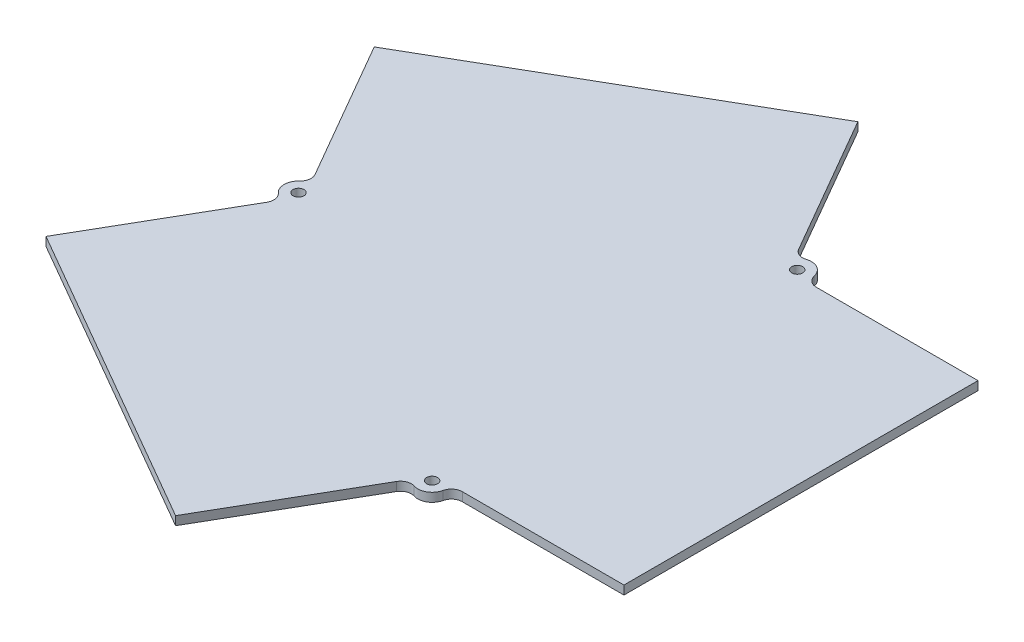
ISO-10303-21;
HEADER;
FILE_DESCRIPTION(('STEP AP214'),'2;1');
FILE_NAME('part.step','',(''),(''),'','','');
FILE_SCHEMA(('AUTOMOTIVE_DESIGN { 1 0 10303 214 1 1 1 1 }'));
ENDSEC;
DATA;
#1=APPLICATION_CONTEXT('core data for automotive mechanical design processes');
#2=APPLICATION_PROTOCOL_DEFINITION('international standard','automotive_design',2000,#1);
#3=PRODUCT_CONTEXT('',#1,'mechanical');
#4=PRODUCT('Part','Part','',(#3));
#5=PRODUCT_RELATED_PRODUCT_CATEGORY('part','',(#4));
#6=PRODUCT_DEFINITION_FORMATION('','',#4);
#7=PRODUCT_DEFINITION_CONTEXT('part definition',#1,'design');
#8=PRODUCT_DEFINITION('design','',#6,#7);
#9=PRODUCT_DEFINITION_SHAPE('','',#8);
#10=(LENGTH_UNIT() NAMED_UNIT(*) SI_UNIT(.MILLI.,.METRE.));
#11=(NAMED_UNIT(*) PLANE_ANGLE_UNIT() SI_UNIT($,.RADIAN.));
#12=(NAMED_UNIT(*) SI_UNIT($,.STERADIAN.) SOLID_ANGLE_UNIT());
#13=UNCERTAINTY_MEASURE_WITH_UNIT(LENGTH_MEASURE(1.E-05),#10,'distance_accuracy_value','');
#14=(GEOMETRIC_REPRESENTATION_CONTEXT(3) GLOBAL_UNCERTAINTY_ASSIGNED_CONTEXT((#13)) GLOBAL_UNIT_ASSIGNED_CONTEXT((#10,
#11,#12)) REPRESENTATION_CONTEXT('',''));
#15=CARTESIAN_POINT('',(0.,0.,0.));
#16=DIRECTION('',(0.,0.,1.));
#17=DIRECTION('',(1.,0.,0.));
#18=AXIS2_PLACEMENT_3D('',#15,#16,#17);
#19=CARTESIAN_POINT('',(-48.8921352138346,2.,28.227887426963));
#20=DIRECTION('',(-0.866025403784438,0.,0.500000000000001));
#21=DIRECTION('',(0.500000000000001,0.,0.866025403784438));
#22=AXIS2_PLACEMENT_3D('',#19,#20,#21);
#23=PLANE('',#22);
#24=DIRECTION('',(-0.500000000000001,0.,-0.866025403784438));
#25=VECTOR('',#24,1.);
#26=CARTESIAN_POINT('',(-48.8921352138346,0.,28.227887426963));
#27=LINE('',#26,#25);
#28=CARTESIAN_POINT('',(-85.4700101744345,0.,-35.1268504376975));
#29=VERTEX_POINT('',#28);
#30=CARTESIAN_POINT('',(-103.965757812806,0.,-67.1624250713291));
#31=VERTEX_POINT('',#30);
#32=EDGE_CURVE('E247',#29,#31,#27,.T.);
#33=ORIENTED_EDGE('',*,*,#32,.F.);
#34=DIRECTION('',(0.,-1.,0.));
#35=VECTOR('',#34,1.);
#36=CARTESIAN_POINT('',(-85.4700101744345,2.,-35.1268504376974));
#37=LINE('',#36,#35);
#38=CARTESIAN_POINT('',(-85.4700101744345,2.,-35.1268504376975));
#39=VERTEX_POINT('',#38);
#40=EDGE_CURVE('E62',#29,#39,#37,.F.);
#41=ORIENTED_EDGE('',*,*,#40,.T.);
#42=DIRECTION('',(-0.500000000000001,0.,-0.866025403784438));
#43=VECTOR('',#42,1.);
#44=CARTESIAN_POINT('',(-48.8921352138346,2.,28.227887426963));
#45=LINE('',#44,#43);
#46=CARTESIAN_POINT('',(-103.965757812806,2.,-67.1624250713291));
#47=VERTEX_POINT('',#46);
#48=EDGE_CURVE('E464',#39,#47,#45,.T.);
#49=ORIENTED_EDGE('',*,*,#48,.T.);
#50=DIRECTION('',(0.,-1.,0.));
#51=VECTOR('',#50,1.);
#52=CARTESIAN_POINT('',(-103.965757812806,2.,-67.1624250713291));
#53=LINE('',#52,#51);
#54=EDGE_CURVE('E234',#47,#31,#53,.T.);
#55=ORIENTED_EDGE('',*,*,#54,.T.);
#56=EDGE_LOOP('',(#33,#41,#49,#55));
#57=FACE_BOUND('',#56,.T.);
#58=ADVANCED_FACE('F46',(#57),#23,.T.);
#59=CARTESIAN_POINT('',(-83.7503568198725,2.,-29.6150024593988));
#60=DIRECTION('',(0.,-1.,0.));
#61=DIRECTION('',(0.,0.,-1.));
#62=AXIS2_PLACEMENT_3D('',#59,#60,#61);
#63=CYLINDRICAL_SURFACE('',#62,3.26666049839541);
#64=CARTESIAN_POINT('',(-83.7503568198725,0.,-29.6150024593988));
#65=DIRECTION('',(0.,1.,0.));
#66=DIRECTION('',(0.,0.,1.));
#67=AXIS2_PLACEMENT_3D('',#64,#65,#66);
#68=CIRCLE('',#67,3.26666049839541);
#69=CARTESIAN_POINT('',(-85.9509460743788,0.,-32.0292265054907));
#70=VERTEX_POINT('',#69);
#71=CARTESIAN_POINT('',(-85.9509460743788,0.,-27.2007784133069));
#72=VERTEX_POINT('',#71);
#73=EDGE_CURVE('E250',#70,#72,#68,.T.);
#74=ORIENTED_EDGE('',*,*,#73,.T.);
#75=DIRECTION('',(0.,-1.,0.));
#76=VECTOR('',#75,1.);
#77=CARTESIAN_POINT('',(-85.9509460743788,2.,-27.2007784133069));
#78=LINE('',#77,#76);
#79=CARTESIAN_POINT('',(-85.9509460743788,2.,-27.2007784133069));
#80=VERTEX_POINT('',#79);
#81=EDGE_CURVE('E339',#72,#80,#78,.F.);
#82=ORIENTED_EDGE('',*,*,#81,.T.);
#83=CARTESIAN_POINT('',(-83.7503568198725,2.,-29.6150024593988));
#84=DIRECTION('',(0.,1.,0.));
#85=DIRECTION('',(0.,0.,1.));
#86=AXIS2_PLACEMENT_3D('',#83,#84,#85);
#87=CIRCLE('',#86,3.26666049839541);
#88=CARTESIAN_POINT('',(-85.9509460743788,2.,-32.0292265054907));
#89=VERTEX_POINT('',#88);
#90=EDGE_CURVE('E195',#89,#80,#87,.T.);
#91=ORIENTED_EDGE('',*,*,#90,.F.);
#92=DIRECTION('',(0.,-1.,0.));
#93=VECTOR('',#92,1.);
#94=CARTESIAN_POINT('',(-85.9509460743788,2.,-32.0292265054907));
#95=LINE('',#94,#93);
#96=EDGE_CURVE('E335',#89,#70,#95,.T.);
#97=ORIENTED_EDGE('',*,*,#96,.T.);
#98=EDGE_LOOP('',(#74,#82,#91,#97));
#99=FACE_BOUND('',#98,.T.);
#100=ADVANCED_FACE('F377',(#99),#63,.T.);
#101=CARTESIAN_POINT('',(-74.5394796768128,2.,-43.0353886566623));
#102=DIRECTION('',(-0.86602540378444,0.,-0.499999999999998));
#103=DIRECTION('',(-0.499999999999998,0.,0.86602540378444));
#104=AXIS2_PLACEMENT_3D('',#101,#102,#103);
#105=PLANE('',#104);
#106=DIRECTION('',(0.499999999999998,0.,-0.86602540378444));
#107=VECTOR('',#106,1.);
#108=CARTESIAN_POINT('',(-74.5394796768128,2.,-43.0353886566623));
#109=LINE('',#108,#107);
#110=CARTESIAN_POINT('',(-103.965757812805,2.,7.93242015252989));
#111=VERTEX_POINT('',#110);
#112=CARTESIAN_POINT('',(-85.4700101744346,2.,-24.1031544811002));
#113=VERTEX_POINT('',#112);
#114=EDGE_CURVE('E174',#111,#113,#109,.T.);
#115=ORIENTED_EDGE('',*,*,#114,.T.);
#116=DIRECTION('',(0.,-1.,0.));
#117=VECTOR('',#116,1.);
#118=CARTESIAN_POINT('',(-85.4700101744346,2.,-24.1031544811002));
#119=LINE('',#118,#117);
#120=CARTESIAN_POINT('',(-85.4700101744346,0.,-24.1031544811002));
#121=VERTEX_POINT('',#120);
#122=EDGE_CURVE('E332',#113,#121,#119,.T.);
#123=ORIENTED_EDGE('',*,*,#122,.T.);
#124=DIRECTION('',(0.499999999999998,0.,-0.86602540378444));
#125=VECTOR('',#124,1.);
#126=CARTESIAN_POINT('',(-74.5394796768128,0.,-43.0353886566623));
#127=LINE('',#126,#125);
#128=CARTESIAN_POINT('',(-103.965757812805,0.,7.93242015252989));
#129=VERTEX_POINT('',#128);
#130=EDGE_CURVE('E177',#129,#121,#127,.T.);
#131=ORIENTED_EDGE('',*,*,#130,.F.);
#132=DIRECTION('',(0.,-1.,0.));
#133=VECTOR('',#132,1.);
#134=CARTESIAN_POINT('',(-103.965757812805,2.,7.93242015252989));
#135=LINE('',#134,#133);
#136=EDGE_CURVE('E170',#111,#129,#135,.T.);
#137=ORIENTED_EDGE('',*,*,#136,.F.);
#138=EDGE_LOOP('',(#115,#123,#131,#137));
#139=FACE_BOUND('',#138,.T.);
#140=ADVANCED_FACE('F172',(#139),#105,.T.);
#141=CARTESIAN_POINT('',(-29.4262781359925,2.,50.9678088091923));
#142=DIRECTION('',(-0.5,0.,0.866025403784439));
#143=DIRECTION('',(0.866025403784439,0.,0.5));
#144=AXIS2_PLACEMENT_3D('',#141,#142,#143);
#145=PLANE('',#144);
#146=DIRECTION('',(-0.866025403784439,0.,-0.5));
#147=VECTOR('',#146,1.);
#148=CARTESIAN_POINT('',(-29.4262781359925,0.,50.9678088091923));
#149=LINE('',#148,#147);
#150=CARTESIAN_POINT('',(-33.8177001062657,0.,48.4324201525298));
#151=VERTEX_POINT('',#150);
#152=EDGE_CURVE('E256',#151,#129,#149,.T.);
#153=ORIENTED_EDGE('',*,*,#152,.F.);
#154=DIRECTION('',(0.,-1.,0.));
#155=VECTOR('',#154,1.);
#156=CARTESIAN_POINT('',(-33.8177001062657,2.,48.4324201525298));
#157=LINE('',#156,#155);
#158=CARTESIAN_POINT('',(-33.8177001062657,2.,48.4324201525298));
#159=VERTEX_POINT('',#158);
#160=EDGE_CURVE('E184',#159,#151,#157,.T.);
#161=ORIENTED_EDGE('',*,*,#160,.F.);
#162=DIRECTION('',(-0.866025403784439,0.,-0.5));
#163=VECTOR('',#162,1.);
#164=CARTESIAN_POINT('',(-29.4262781359925,2.,50.9678088091923));
#165=LINE('',#164,#163);
#166=EDGE_CURVE('E190',#159,#111,#165,.T.);
#167=ORIENTED_EDGE('',*,*,#166,.T.);
#168=ORIENTED_EDGE('',*,*,#136,.T.);
#169=EDGE_LOOP('',(#153,#161,#167,#168));
#170=FACE_BOUND('',#169,.T.);
#171=ADVANCED_FACE('F198',(#170),#145,.T.);
#172=CARTESIAN_POINT('',(-4.39142197027308,2.,-2.53538865666241));
#173=DIRECTION('',(0.866025403784438,0.,0.500000000000001));
#174=DIRECTION('',(0.500000000000001,0.,-0.866025403784438));
#175=AXIS2_PLACEMENT_3D('',#172,#173,#174);
#176=PLANE('',#175);
#177=DIRECTION('',(-0.500000000000001,0.,0.866025403784438));
#178=VECTOR('',#177,1.);
#179=CARTESIAN_POINT('',(-4.39142197027308,0.,-2.53538865666241));
#180=LINE('',#179,#178);
#181=CARTESIAN_POINT('',(-15.321952467894,0.,16.3968455188981));
#182=VERTEX_POINT('',#181);
#183=EDGE_CURVE('E259',#182,#151,#180,.T.);
#184=ORIENTED_EDGE('',*,*,#183,.F.);
#185=DIRECTION('',(0.,-1.,0.));
#186=VECTOR('',#185,1.);
#187=CARTESIAN_POINT('',(-15.321952467894,2.,16.3968455188982));
#188=LINE('',#187,#186);
#189=CARTESIAN_POINT('',(-15.321952467894,2.,16.3968455188981));
#190=VERTEX_POINT('',#189);
#191=EDGE_CURVE('E325',#182,#190,#188,.F.);
#192=ORIENTED_EDGE('',*,*,#191,.T.);
#193=DIRECTION('',(-0.500000000000001,0.,0.866025403784438));
#194=VECTOR('',#193,1.);
#195=CARTESIAN_POINT('',(-4.39142197027308,2.,-2.53538865666241));
#196=LINE('',#195,#194);
#197=EDGE_CURVE('E201',#190,#159,#196,.T.);
#198=ORIENTED_EDGE('',*,*,#197,.T.);
#199=ORIENTED_EDGE('',*,*,#160,.T.);
#200=EDGE_LOOP('',(#184,#192,#198,#199));
#201=FACE_BOUND('',#200,.T.);
#202=ADVANCED_FACE('F514',(#201),#176,.T.);
#203=CARTESIAN_POINT('',(-11.4083787741721,2.,12.1516580389955));
#204=DIRECTION('',(0.,-1.,0.));
#205=DIRECTION('',(0.,0.,-1.));
#206=AXIS2_PLACEMENT_3D('',#203,#204,#205);
#207=CYLINDRICAL_SURFACE('',#206,3.26666049839439);
#208=CARTESIAN_POINT('',(-11.4083787741721,2.,12.1516580389955));
#209=DIRECTION('',(0.,1.,0.));
#210=DIRECTION('',(0.,0.,1.));
#211=AXIS2_PLACEMENT_3D('',#208,#209,#210);
#212=CIRCLE('',#211,3.26666049839439);
#213=CARTESIAN_POINT('',(-12.3988635012608,2.,15.2645362597383));
#214=VERTEX_POINT('',#213);
#215=CARTESIAN_POINT('',(-8.21730479257729,2.,12.8503122136476));
#216=VERTEX_POINT('',#215);
#217=EDGE_CURVE('E204',#214,#216,#212,.T.);
#218=ORIENTED_EDGE('',*,*,#217,.F.);
#219=DIRECTION('',(0.,-1.,0.));
#220=VECTOR('',#219,1.);
#221=CARTESIAN_POINT('',(-12.3988635012608,2.,15.2645362597383));
#222=LINE('',#221,#220);
#223=CARTESIAN_POINT('',(-12.3988635012608,0.,15.2645362597383));
#224=VERTEX_POINT('',#223);
#225=EDGE_CURVE('E321',#214,#224,#222,.T.);
#226=ORIENTED_EDGE('',*,*,#225,.T.);
#227=CARTESIAN_POINT('',(-11.4083787741721,0.,12.1516580389955));
#228=DIRECTION('',(0.,1.,0.));
#229=DIRECTION('',(0.,0.,1.));
#230=AXIS2_PLACEMENT_3D('',#227,#228,#229);
#231=CIRCLE('',#230,3.26666049839439);
#232=CARTESIAN_POINT('',(-8.21730479257729,0.,12.8503122136476));
#233=VERTEX_POINT('',#232);
#234=EDGE_CURVE('E262',#224,#233,#231,.T.);
#235=ORIENTED_EDGE('',*,*,#234,.T.);
#236=DIRECTION('',(0.,-1.,0.));
#237=VECTOR('',#236,1.);
#238=CARTESIAN_POINT('',(-8.21730479257729,2.,12.8503122136476));
#239=LINE('',#238,#237);
#240=EDGE_CURVE('E318',#233,#216,#239,.F.);
#241=ORIENTED_EDGE('',*,*,#240,.T.);
#242=EDGE_LOOP('',(#218,#226,#235,#241));
#243=FACE_BOUND('',#242,.T.);
#244=ADVANCED_FACE('F431',(#243),#207,.T.);
#245=CARTESIAN_POINT('',(0.,2.,10.8849975406012));
#246=DIRECTION('',(0.,0.,1.));
#247=DIRECTION('',(1.,0.,0.));
#248=AXIS2_PLACEMENT_3D('',#245,#246,#247);
#249=PLANE('',#248);
#250=DIRECTION('',(-1.,0.,0.));
#251=VECTOR('',#250,1.);
#252=CARTESIAN_POINT('',(0.,2.,10.8849975406012));
#253=LINE('',#252,#251);
#254=CARTESIAN_POINT('',(31.2163435508577,2.,10.8849975406012));
#255=VERTEX_POINT('',#254);
#256=CARTESIAN_POINT('',(-5.77515172588787,2.,10.8849975406012));
#257=VERTEX_POINT('',#256);
#258=EDGE_CURVE('E211',#255,#257,#253,.T.);
#259=ORIENTED_EDGE('',*,*,#258,.T.);
#260=DIRECTION('',(0.,-1.,0.));
#261=VECTOR('',#260,1.);
#262=CARTESIAN_POINT('',(-5.77515172588787,2.,10.8849975406012));
#263=LINE('',#262,#261);
#264=CARTESIAN_POINT('',(-5.77515172588787,0.,10.8849975406012));
#265=VERTEX_POINT('',#264);
#266=EDGE_CURVE('E328',#257,#265,#263,.T.);
#267=ORIENTED_EDGE('',*,*,#266,.T.);
#268=DIRECTION('',(-1.,0.,0.));
#269=VECTOR('',#268,1.);
#270=CARTESIAN_POINT('',(0.,0.,10.8849975406012));
#271=LINE('',#270,#269);
#272=CARTESIAN_POINT('',(31.2163435508577,0.,10.8849975406012));
#273=VERTEX_POINT('',#272);
#274=EDGE_CURVE('E266',#273,#265,#271,.T.);
#275=ORIENTED_EDGE('',*,*,#274,.F.);
#276=DIRECTION('',(0.,-1.,0.));
#277=VECTOR('',#276,1.);
#278=CARTESIAN_POINT('',(31.2163435508577,2.,10.8849975406012));
#279=LINE('',#278,#277);
#280=EDGE_CURVE('E300',#255,#273,#279,.T.);
#281=ORIENTED_EDGE('',*,*,#280,.F.);
#282=EDGE_LOOP('',(#259,#267,#275,#281));
#283=FACE_BOUND('',#282,.T.);
#284=ADVANCED_FACE('F438',(#283),#249,.T.);
#285=CARTESIAN_POINT('',(31.2163435508577,2.,0.));
#286=DIRECTION('',(1.,0.,0.));
#287=DIRECTION('',(0.,0.,-1.));
#288=AXIS2_PLACEMENT_3D('',#285,#286,#287);
#289=PLANE('',#288);
#290=DIRECTION('',(0.,0.,1.));
#291=VECTOR('',#290,1.);
#292=CARTESIAN_POINT('',(31.2163435508577,0.,0.));
#293=LINE('',#292,#291);
#294=CARTESIAN_POINT('',(31.2163435508577,0.,-70.1150024594117));
#295=VERTEX_POINT('',#294);
#296=EDGE_CURVE('E270',#295,#273,#293,.T.);
#297=ORIENTED_EDGE('',*,*,#296,.F.);
#298=DIRECTION('',(0.,-1.,0.));
#299=VECTOR('',#298,1.);
#300=CARTESIAN_POINT('',(31.2163435508577,2.,-70.1150024594117));
#301=LINE('',#300,#299);
#302=CARTESIAN_POINT('',(31.2163435508577,2.,-70.1150024594117));
#303=VERTEX_POINT('',#302);
#304=EDGE_CURVE('E296',#303,#295,#301,.T.);
#305=ORIENTED_EDGE('',*,*,#304,.F.);
#306=DIRECTION('',(0.,0.,1.));
#307=VECTOR('',#306,1.);
#308=CARTESIAN_POINT('',(31.2163435508577,2.,0.));
#309=LINE('',#308,#307);
#310=EDGE_CURVE('E215',#303,#255,#309,.T.);
#311=ORIENTED_EDGE('',*,*,#310,.T.);
#312=ORIENTED_EDGE('',*,*,#280,.T.);
#313=EDGE_LOOP('',(#297,#305,#311,#312));
#314=FACE_BOUND('',#313,.T.);
#315=ADVANCED_FACE('F442',(#314),#289,.T.);
#316=CARTESIAN_POINT('',(0.,2.,-70.1150024594117));
#317=DIRECTION('',(0.,0.,-1.));
#318=DIRECTION('',(-1.,0.,0.));
#319=AXIS2_PLACEMENT_3D('',#316,#317,#318);
#320=PLANE('',#319);
#321=DIRECTION('',(1.,0.,0.));
#322=VECTOR('',#321,1.);
#323=CARTESIAN_POINT('',(0.,0.,-70.1150024594117));
#324=LINE('',#323,#322);
#325=CARTESIAN_POINT('',(-5.77515172586313,0.,-70.1150024594117));
#326=VERTEX_POINT('',#325);
#327=EDGE_CURVE('E274',#326,#295,#324,.T.);
#328=ORIENTED_EDGE('',*,*,#327,.F.);
#329=DIRECTION('',(0.,-1.,0.));
#330=VECTOR('',#329,1.);
#331=CARTESIAN_POINT('',(-5.77515172586313,2.,-70.1150024594117));
#332=LINE('',#331,#330);
#333=CARTESIAN_POINT('',(-5.77515172586313,2.,-70.1150024594117));
#334=VERTEX_POINT('',#333);
#335=EDGE_CURVE('E315',#326,#334,#332,.F.);
#336=ORIENTED_EDGE('',*,*,#335,.T.);
#337=DIRECTION('',(1.,0.,0.));
#338=VECTOR('',#337,1.);
#339=CARTESIAN_POINT('',(0.,2.,-70.1150024594117));
#340=LINE('',#339,#338);
#341=EDGE_CURVE('E219',#334,#303,#340,.T.);
#342=ORIENTED_EDGE('',*,*,#341,.T.);
#343=ORIENTED_EDGE('',*,*,#304,.T.);
#344=EDGE_LOOP('',(#328,#336,#342,#343));
#345=FACE_BOUND('',#344,.T.);
#346=ADVANCED_FACE('F505',(#345),#320,.T.);
#347=CARTESIAN_POINT('',(-11.4083787741483,2.,-71.3816629578069));
#348=DIRECTION('',(0.,-1.,0.));
#349=DIRECTION('',(0.,0.,-1.));
#350=AXIS2_PLACEMENT_3D('',#347,#348,#349);
#351=CYLINDRICAL_SURFACE('',#350,3.26666049839515);
#352=CARTESIAN_POINT('',(-11.4083787741483,0.,-71.3816629578069));
#353=DIRECTION('',(0.,1.,0.));
#354=DIRECTION('',(0.,0.,1.));
#355=AXIS2_PLACEMENT_3D('',#352,#353,#354);
#356=CIRCLE('',#355,3.26666049839515);
#357=CARTESIAN_POINT('',(-8.21730479255264,0.,-72.0803171324586));
#358=VERTEX_POINT('',#357);
#359=CARTESIAN_POINT('',(-12.3988635012377,0.,-74.4945411785501));
#360=VERTEX_POINT('',#359);
#361=EDGE_CURVE('E277',#358,#360,#356,.T.);
#362=ORIENTED_EDGE('',*,*,#361,.T.);
#363=DIRECTION('',(0.,-1.,0.));
#364=VECTOR('',#363,1.);
#365=CARTESIAN_POINT('',(-12.3988635012377,2.,-74.4945411785501));
#366=LINE('',#365,#364);
#367=CARTESIAN_POINT('',(-12.3988635012377,2.,-74.4945411785501));
#368=VERTEX_POINT('',#367);
#369=EDGE_CURVE('E312',#360,#368,#366,.F.);
#370=ORIENTED_EDGE('',*,*,#369,.T.);
#371=CARTESIAN_POINT('',(-11.4083787741483,2.,-71.3816629578069));
#372=DIRECTION('',(0.,1.,0.));
#373=DIRECTION('',(0.,0.,1.));
#374=AXIS2_PLACEMENT_3D('',#371,#372,#373);
#375=CIRCLE('',#374,3.26666049839515);
#376=CARTESIAN_POINT('',(-8.21730479255264,2.,-72.0803171324586));
#377=VERTEX_POINT('',#376);
#378=EDGE_CURVE('E222',#377,#368,#375,.T.);
#379=ORIENTED_EDGE('',*,*,#378,.F.);
#380=DIRECTION('',(0.,-1.,0.));
#381=VECTOR('',#380,1.);
#382=CARTESIAN_POINT('',(-8.21730479255264,2.,-72.0803171324586));
#383=LINE('',#382,#381);
#384=EDGE_CURVE('E308',#377,#358,#383,.T.);
#385=ORIENTED_EDGE('',*,*,#384,.T.);
#386=EDGE_LOOP('',(#362,#370,#379,#385));
#387=FACE_BOUND('',#386,.T.);
#388=ADVANCED_FACE('F452',(#387),#351,.T.);
#389=CARTESIAN_POINT('',(21.255922492728,2.,-12.2721125730503));
#390=DIRECTION('',(0.866025403784438,0.,-0.5));
#391=DIRECTION('',(-0.5,0.,-0.866025403784439));
#392=AXIS2_PLACEMENT_3D('',#389,#390,#391);
#393=PLANE('',#392);
#394=DIRECTION('',(0.5,0.,0.866025403784439));
#395=VECTOR('',#394,1.);
#396=CARTESIAN_POINT('',(21.255922492728,2.,-12.2721125730503));
#397=LINE('',#396,#395);
#398=CARTESIAN_POINT('',(-33.8177001062435,2.,-107.662425071342));
#399=VERTEX_POINT('',#398);
#400=CARTESIAN_POINT('',(-15.3219524678714,2.,-75.6268504377099));
#401=VERTEX_POINT('',#400);
#402=EDGE_CURVE('E226',#399,#401,#397,.T.);
#403=ORIENTED_EDGE('',*,*,#402,.T.);
#404=DIRECTION('',(0.,-1.,0.));
#405=VECTOR('',#404,1.);
#406=CARTESIAN_POINT('',(-15.3219524678714,2.,-75.6268504377099));
#407=LINE('',#406,#405);
#408=CARTESIAN_POINT('',(-15.3219524678714,0.,-75.6268504377099));
#409=VERTEX_POINT('',#408);
#410=EDGE_CURVE('E183',#401,#409,#407,.T.);
#411=ORIENTED_EDGE('',*,*,#410,.T.);
#412=DIRECTION('',(0.5,0.,0.866025403784439));
#413=VECTOR('',#412,1.);
#414=CARTESIAN_POINT('',(21.255922492728,0.,-12.2721125730503));
#415=LINE('',#414,#413);
#416=CARTESIAN_POINT('',(-33.8177001062435,0.,-107.662425071342));
#417=VERTEX_POINT('',#416);
#418=EDGE_CURVE('E281',#417,#409,#415,.T.);
#419=ORIENTED_EDGE('',*,*,#418,.F.);
#420=DIRECTION('',(0.,-1.,0.));
#421=VECTOR('',#420,1.);
#422=CARTESIAN_POINT('',(-33.8177001062435,2.,-107.662425071342));
#423=LINE('',#422,#421);
#424=EDGE_CURVE('E293',#399,#417,#423,.T.);
#425=ORIENTED_EDGE('',*,*,#424,.F.);
#426=EDGE_LOOP('',(#403,#411,#419,#425));
#427=FACE_BOUND('',#426,.T.);
#428=ADVANCED_FACE('F403',(#427),#393,.T.);
#429=CARTESIAN_POINT('',(-11.4083787741721,2.,12.1516580389955));
#430=DIRECTION('',(0.,-1.,0.));
#431=DIRECTION('',(0.,0.,-1.));
#432=AXIS2_PLACEMENT_3D('',#429,#430,#431);
#433=CYLINDRICAL_SURFACE('',#432,1.25);
#434=CARTESIAN_POINT('',(-11.4083787741721,2.,12.1516580389955));
#435=DIRECTION('',(0.,1.,0.));
#436=DIRECTION('',(0.,0.,1.));
#437=AXIS2_PLACEMENT_3D('',#434,#435,#436);
#438=CIRCLE('',#437,1.25);
#439=CARTESIAN_POINT('',(-11.4083787741721,2.,13.4016580389955));
#440=VERTEX_POINT('',#439);
#441=EDGE_CURVE('E467',#440,#440,#438,.T.);
#442=ORIENTED_EDGE('',*,*,#441,.T.);
#443=EDGE_LOOP('',(#442));
#444=FACE_BOUND('',#443,.T.);
#445=CARTESIAN_POINT('',(-11.4083787741721,0.,12.1516580389955));
#446=DIRECTION('',(0.,1.,0.));
#447=DIRECTION('',(0.,0.,1.));
#448=AXIS2_PLACEMENT_3D('',#445,#446,#447);
#449=CIRCLE('',#448,1.25);
#450=CARTESIAN_POINT('',(-11.4083787741721,0.,13.4016580389955));
#451=VERTEX_POINT('',#450);
#452=EDGE_CURVE('E243',#451,#451,#449,.T.);
#453=ORIENTED_EDGE('',*,*,#452,.F.);
#454=EDGE_LOOP('',(#453));
#455=FACE_BOUND('',#454,.T.);
#456=ADVANCED_FACE('F399',(#444,#455),#433,.F.);
#457=CARTESIAN_POINT('',(-11.4083787741483,2.,-71.3816629578069));
#458=DIRECTION('',(0.,-1.,0.));
#459=DIRECTION('',(0.,0.,-1.));
#460=AXIS2_PLACEMENT_3D('',#457,#458,#459);
#461=CYLINDRICAL_SURFACE('',#460,1.25);
#462=CARTESIAN_POINT('',(-11.4083787741483,2.,-71.3816629578069));
#463=DIRECTION('',(0.,1.,0.));
#464=DIRECTION('',(0.,0.,1.));
#465=AXIS2_PLACEMENT_3D('',#462,#463,#464);
#466=CIRCLE('',#465,1.25);
#467=CARTESIAN_POINT('',(-11.4083787741483,2.,-70.1316629578068));
#468=VERTEX_POINT('',#467);
#469=EDGE_CURVE('E472',#468,#468,#466,.T.);
#470=ORIENTED_EDGE('',*,*,#469,.T.);
#471=EDGE_LOOP('',(#470));
#472=FACE_BOUND('',#471,.T.);
#473=CARTESIAN_POINT('',(-11.4083787741483,0.,-71.3816629578069));
#474=DIRECTION('',(0.,1.,0.));
#475=DIRECTION('',(0.,0.,1.));
#476=AXIS2_PLACEMENT_3D('',#473,#474,#475);
#477=CIRCLE('',#476,1.25);
#478=CARTESIAN_POINT('',(-11.4083787741483,0.,-70.1316629578068));
#479=VERTEX_POINT('',#478);
#480=EDGE_CURVE('E239',#479,#479,#477,.T.);
#481=ORIENTED_EDGE('',*,*,#480,.F.);
#482=EDGE_LOOP('',(#481));
#483=FACE_BOUND('',#482,.T.);
#484=ADVANCED_FACE('F402',(#472,#483),#461,.F.);
#485=CARTESIAN_POINT('',(-83.7503568198725,2.,-29.6150024593988));
#486=DIRECTION('',(0.,-1.,0.));
#487=DIRECTION('',(0.,0.,-1.));
#488=AXIS2_PLACEMENT_3D('',#485,#486,#487);
#489=CYLINDRICAL_SURFACE('',#488,1.25);
#490=CARTESIAN_POINT('',(-83.7503568198725,2.,-29.6150024593988));
#491=DIRECTION('',(0.,1.,0.));
#492=DIRECTION('',(0.,0.,1.));
#493=AXIS2_PLACEMENT_3D('',#490,#491,#492);
#494=CIRCLE('',#493,1.25);
#495=CARTESIAN_POINT('',(-83.7503568198725,2.,-28.3650024593988));
#496=VERTEX_POINT('',#495);
#497=EDGE_CURVE('E289',#496,#496,#494,.T.);
#498=ORIENTED_EDGE('',*,*,#497,.T.);
#499=EDGE_LOOP('',(#498));
#500=FACE_BOUND('',#499,.T.);
#501=CARTESIAN_POINT('',(-83.7503568198725,0.,-29.6150024593988));
#502=DIRECTION('',(0.,1.,0.));
#503=DIRECTION('',(0.,0.,1.));
#504=AXIS2_PLACEMENT_3D('',#501,#502,#503);
#505=CIRCLE('',#504,1.25);
#506=CARTESIAN_POINT('',(-83.7503568198725,0.,-28.3650024593988));
#507=VERTEX_POINT('',#506);
#508=EDGE_CURVE('E235',#507,#507,#505,.T.);
#509=ORIENTED_EDGE('',*,*,#508,.F.);
#510=EDGE_LOOP('',(#509));
#511=FACE_BOUND('',#510,.T.);
#512=ADVANCED_FACE('F407',(#500,#511),#489,.F.);
#513=CARTESIAN_POINT('',(-55.0736225989715,2.,-95.3903124982921));
#514=DIRECTION('',(-0.5,0.,-0.866025403784439));
#515=DIRECTION('',(-0.866025403784439,0.,0.5));
#516=AXIS2_PLACEMENT_3D('',#513,#514,#515);
#517=PLANE('',#516);
#518=DIRECTION('',(0.866025403784439,0.,-0.5));
#519=VECTOR('',#518,1.);
#520=CARTESIAN_POINT('',(-55.0736225989715,0.,-95.3903124982921));
#521=LINE('',#520,#519);
#522=EDGE_CURVE('E285',#31,#417,#521,.T.);
#523=ORIENTED_EDGE('',*,*,#522,.F.);
#524=ORIENTED_EDGE('',*,*,#54,.F.);
#525=DIRECTION('',(0.866025403784439,0.,-0.5));
#526=VECTOR('',#525,1.);
#527=CARTESIAN_POINT('',(-55.0736225989715,2.,-95.3903124982921));
#528=LINE('',#527,#526);
#529=EDGE_CURVE('E230',#47,#399,#528,.T.);
#530=ORIENTED_EDGE('',*,*,#529,.T.);
#531=ORIENTED_EDGE('',*,*,#424,.T.);
#532=EDGE_LOOP('',(#523,#524,#530,#531));
#533=FACE_BOUND('',#532,.T.);
#534=ADVANCED_FACE('F411',(#533),#517,.T.);
#535=CARTESIAN_POINT('',(0.,2.,0.));
#536=DIRECTION('',(0.,1.,0.));
#537=DIRECTION('',(0.,0.,1.));
#538=AXIS2_PLACEMENT_3D('',#535,#536,#537);
#539=PLANE('',#538);
#540=ORIENTED_EDGE('',*,*,#497,.F.);
#541=EDGE_LOOP('',(#540));
#542=FACE_BOUND('',#541,.T.);
#543=ORIENTED_EDGE('',*,*,#469,.F.);
#544=EDGE_LOOP('',(#543));
#545=FACE_BOUND('',#544,.T.);
#546=ORIENTED_EDGE('',*,*,#441,.F.);
#547=EDGE_LOOP('',(#546));
#548=FACE_BOUND('',#547,.T.);
#549=ORIENTED_EDGE('',*,*,#48,.F.);
#550=CARTESIAN_POINT('',(-87.6350736838956,2.,-33.8768504376974));
#551=DIRECTION('',(0.,1.,0.));
#552=DIRECTION('',(0.,0.,1.));
#553=AXIS2_PLACEMENT_3D('',#550,#551,#552);
#554=CIRCLE('',#553,2.5);
#555=EDGE_CURVE('E11',#39,#89,#554,.F.);
#556=ORIENTED_EDGE('',*,*,#555,.T.);
#557=ORIENTED_EDGE('',*,*,#90,.T.);
#558=CARTESIAN_POINT('',(-87.6350736838957,2.,-25.3531544811002));
#559=DIRECTION('',(0.,1.,0.));
#560=DIRECTION('',(0.,0.,1.));
#561=AXIS2_PLACEMENT_3D('',#558,#559,#560);
#562=CIRCLE('',#561,2.5);
#563=EDGE_CURVE('E193',#80,#113,#562,.F.);
#564=ORIENTED_EDGE('',*,*,#563,.T.);
#565=ORIENTED_EDGE('',*,*,#114,.F.);
#566=ORIENTED_EDGE('',*,*,#166,.F.);
#567=ORIENTED_EDGE('',*,*,#197,.F.);
#568=CARTESIAN_POINT('',(-13.1568889584329,2.,17.6468455188982));
#569=DIRECTION('',(0.,1.,0.));
#570=DIRECTION('',(0.,0.,1.));
#571=AXIS2_PLACEMENT_3D('',#568,#569,#570);
#572=CIRCLE('',#571,2.5);
#573=EDGE_CURVE('E359',#190,#214,#572,.F.);
#574=ORIENTED_EDGE('',*,*,#573,.T.);
#575=ORIENTED_EDGE('',*,*,#217,.T.);
#576=CARTESIAN_POINT('',(-5.77515172588786,2.,13.3849975406012));
#577=DIRECTION('',(0.,1.,0.));
#578=DIRECTION('',(0.,0.,1.));
#579=AXIS2_PLACEMENT_3D('',#576,#577,#578);
#580=CIRCLE('',#579,2.5);
#581=EDGE_CURVE('E365',#216,#257,#580,.F.);
#582=ORIENTED_EDGE('',*,*,#581,.T.);
#583=ORIENTED_EDGE('',*,*,#258,.F.);
#584=ORIENTED_EDGE('',*,*,#310,.F.);
#585=ORIENTED_EDGE('',*,*,#341,.F.);
#586=CARTESIAN_POINT('',(-5.77515172586313,2.,-72.6150024594117));
#587=DIRECTION('',(0.,1.,0.));
#588=DIRECTION('',(0.,0.,1.));
#589=AXIS2_PLACEMENT_3D('',#586,#587,#588);
#590=CIRCLE('',#589,2.5);
#591=EDGE_CURVE('E353',#334,#377,#590,.F.);
#592=ORIENTED_EDGE('',*,*,#591,.T.);
#593=ORIENTED_EDGE('',*,*,#378,.T.);
#594=CARTESIAN_POINT('',(-13.1568889584103,2.,-76.8768504377099));
#595=DIRECTION('',(0.,1.,0.));
#596=DIRECTION('',(0.,0.,1.));
#597=AXIS2_PLACEMENT_3D('',#594,#595,#596);
#598=CIRCLE('',#597,2.5);
#599=EDGE_CURVE('E347',#368,#401,#598,.F.);
#600=ORIENTED_EDGE('',*,*,#599,.T.);
#601=ORIENTED_EDGE('',*,*,#402,.F.);
#602=ORIENTED_EDGE('',*,*,#529,.F.);
#603=EDGE_LOOP('',(#549,#556,#557,#564,#565,#566,#567,#574,#575,#582,#583,#584,#585,#592,#593,
#600,#601,#602));
#604=FACE_BOUND('',#603,.T.);
#605=ADVANCED_FACE('F188',(#542,#545,#548,#604),#539,.T.);
#606=CARTESIAN_POINT('',(0.,0.,0.));
#607=DIRECTION('',(0.,1.,0.));
#608=DIRECTION('',(0.,0.,1.));
#609=AXIS2_PLACEMENT_3D('',#606,#607,#608);
#610=PLANE('',#609);
#611=ORIENTED_EDGE('',*,*,#508,.T.);
#612=EDGE_LOOP('',(#611));
#613=FACE_BOUND('',#612,.T.);
#614=ORIENTED_EDGE('',*,*,#480,.T.);
#615=EDGE_LOOP('',(#614));
#616=FACE_BOUND('',#615,.T.);
#617=ORIENTED_EDGE('',*,*,#452,.T.);
#618=EDGE_LOOP('',(#617));
#619=FACE_BOUND('',#618,.T.);
#620=ORIENTED_EDGE('',*,*,#73,.F.);
#621=CARTESIAN_POINT('',(-87.6350736838956,0.,-33.8768504376974));
#622=DIRECTION('',(0.,1.,0.));
#623=DIRECTION('',(0.,0.,1.));
#624=AXIS2_PLACEMENT_3D('',#621,#622,#623);
#625=CIRCLE('',#624,2.5);
#626=EDGE_CURVE('E55',#70,#29,#625,.T.);
#627=ORIENTED_EDGE('',*,*,#626,.T.);
#628=ORIENTED_EDGE('',*,*,#32,.T.);
#629=ORIENTED_EDGE('',*,*,#522,.T.);
#630=ORIENTED_EDGE('',*,*,#418,.T.);
#631=CARTESIAN_POINT('',(-13.1568889584103,0.,-76.8768504377099));
#632=DIRECTION('',(0.,1.,0.));
#633=DIRECTION('',(0.,0.,1.));
#634=AXIS2_PLACEMENT_3D('',#631,#632,#633);
#635=CIRCLE('',#634,2.5);
#636=EDGE_CURVE('E344',#409,#360,#635,.T.);
#637=ORIENTED_EDGE('',*,*,#636,.T.);
#638=ORIENTED_EDGE('',*,*,#361,.F.);
#639=CARTESIAN_POINT('',(-5.77515172586313,0.,-72.6150024594117));
#640=DIRECTION('',(0.,1.,0.));
#641=DIRECTION('',(0.,0.,1.));
#642=AXIS2_PLACEMENT_3D('',#639,#640,#641);
#643=CIRCLE('',#642,2.5);
#644=EDGE_CURVE('E350',#358,#326,#643,.T.);
#645=ORIENTED_EDGE('',*,*,#644,.T.);
#646=ORIENTED_EDGE('',*,*,#327,.T.);
#647=ORIENTED_EDGE('',*,*,#296,.T.);
#648=ORIENTED_EDGE('',*,*,#274,.T.);
#649=CARTESIAN_POINT('',(-5.77515172588786,0.,13.3849975406012));
#650=DIRECTION('',(0.,1.,0.));
#651=DIRECTION('',(0.,0.,1.));
#652=AXIS2_PLACEMENT_3D('',#649,#650,#651);
#653=CIRCLE('',#652,2.5);
#654=EDGE_CURVE('E362',#265,#233,#653,.T.);
#655=ORIENTED_EDGE('',*,*,#654,.T.);
#656=ORIENTED_EDGE('',*,*,#234,.F.);
#657=CARTESIAN_POINT('',(-13.1568889584329,0.,17.6468455188982));
#658=DIRECTION('',(0.,1.,0.));
#659=DIRECTION('',(0.,0.,1.));
#660=AXIS2_PLACEMENT_3D('',#657,#658,#659);
#661=CIRCLE('',#660,2.5);
#662=EDGE_CURVE('E356',#224,#182,#661,.T.);
#663=ORIENTED_EDGE('',*,*,#662,.T.);
#664=ORIENTED_EDGE('',*,*,#183,.T.);
#665=ORIENTED_EDGE('',*,*,#152,.T.);
#666=ORIENTED_EDGE('',*,*,#130,.T.);
#667=CARTESIAN_POINT('',(-87.6350736838957,0.,-25.3531544811002));
#668=DIRECTION('',(0.,1.,0.));
#669=DIRECTION('',(0.,0.,1.));
#670=AXIS2_PLACEMENT_3D('',#667,#668,#669);
#671=CIRCLE('',#670,2.5);
#672=EDGE_CURVE('E368',#121,#72,#671,.T.);
#673=ORIENTED_EDGE('',*,*,#672,.T.);
#674=EDGE_LOOP('',(#620,#627,#628,#629,#630,#637,#638,#645,#646,#647,#648,#655,#656,#663,#664,
#665,#666,#673));
#675=FACE_BOUND('',#674,.T.);
#676=ADVANCED_FACE('F373',(#613,#616,#619,#675),#610,.F.);
#677=CARTESIAN_POINT('',(-13.1568889584103,2.,-76.8768504377099));
#678=DIRECTION('',(0.,-1.,0.));
#679=DIRECTION('',(0.,0.,-1.));
#680=AXIS2_PLACEMENT_3D('',#677,#678,#679);
#681=CYLINDRICAL_SURFACE('',#680,2.5);
#682=ORIENTED_EDGE('',*,*,#599,.F.);
#683=ORIENTED_EDGE('',*,*,#369,.F.);
#684=ORIENTED_EDGE('',*,*,#636,.F.);
#685=ORIENTED_EDGE('',*,*,#410,.F.);
#686=EDGE_LOOP('',(#682,#683,#684,#685));
#687=FACE_BOUND('',#686,.T.);
#688=ADVANCED_FACE('F413',(#687),#681,.F.);
#689=CARTESIAN_POINT('',(-5.77515172586313,2.,-72.6150024594117));
#690=DIRECTION('',(0.,-1.,0.));
#691=DIRECTION('',(0.,0.,-1.));
#692=AXIS2_PLACEMENT_3D('',#689,#690,#691);
#693=CYLINDRICAL_SURFACE('',#692,2.5);
#694=ORIENTED_EDGE('',*,*,#591,.F.);
#695=ORIENTED_EDGE('',*,*,#335,.F.);
#696=ORIENTED_EDGE('',*,*,#644,.F.);
#697=ORIENTED_EDGE('',*,*,#384,.F.);
#698=EDGE_LOOP('',(#694,#695,#696,#697));
#699=FACE_BOUND('',#698,.T.);
#700=ADVANCED_FACE('F416',(#699),#693,.F.);
#701=CARTESIAN_POINT('',(-13.1568889584329,2.,17.6468455188982));
#702=DIRECTION('',(0.,-1.,0.));
#703=DIRECTION('',(0.,0.,-1.));
#704=AXIS2_PLACEMENT_3D('',#701,#702,#703);
#705=CYLINDRICAL_SURFACE('',#704,2.5);
#706=ORIENTED_EDGE('',*,*,#573,.F.);
#707=ORIENTED_EDGE('',*,*,#191,.F.);
#708=ORIENTED_EDGE('',*,*,#662,.F.);
#709=ORIENTED_EDGE('',*,*,#225,.F.);
#710=EDGE_LOOP('',(#706,#707,#708,#709));
#711=FACE_BOUND('',#710,.T.);
#712=ADVANCED_FACE('F388',(#711),#705,.F.);
#713=CARTESIAN_POINT('',(-5.77515172588786,2.,13.3849975406012));
#714=DIRECTION('',(0.,-1.,0.));
#715=DIRECTION('',(0.,0.,-1.));
#716=AXIS2_PLACEMENT_3D('',#713,#714,#715);
#717=CYLINDRICAL_SURFACE('',#716,2.5);
#718=ORIENTED_EDGE('',*,*,#581,.F.);
#719=ORIENTED_EDGE('',*,*,#240,.F.);
#720=ORIENTED_EDGE('',*,*,#654,.F.);
#721=ORIENTED_EDGE('',*,*,#266,.F.);
#722=EDGE_LOOP('',(#718,#719,#720,#721));
#723=FACE_BOUND('',#722,.T.);
#724=ADVANCED_FACE('F382',(#723),#717,.F.);
#725=CARTESIAN_POINT('',(-87.6350736838957,2.,-25.3531544811002));
#726=DIRECTION('',(0.,-1.,0.));
#727=DIRECTION('',(0.,0.,-1.));
#728=AXIS2_PLACEMENT_3D('',#725,#726,#727);
#729=CYLINDRICAL_SURFACE('',#728,2.5);
#730=ORIENTED_EDGE('',*,*,#563,.F.);
#731=ORIENTED_EDGE('',*,*,#81,.F.);
#732=ORIENTED_EDGE('',*,*,#672,.F.);
#733=ORIENTED_EDGE('',*,*,#122,.F.);
#734=EDGE_LOOP('',(#730,#731,#732,#733));
#735=FACE_BOUND('',#734,.T.);
#736=ADVANCED_FACE('F380',(#735),#729,.F.);
#737=CARTESIAN_POINT('',(-87.6350736838956,2.,-33.8768504376974));
#738=DIRECTION('',(0.,-1.,0.));
#739=DIRECTION('',(0.,0.,-1.));
#740=AXIS2_PLACEMENT_3D('',#737,#738,#739);
#741=CYLINDRICAL_SURFACE('',#740,2.5);
#742=ORIENTED_EDGE('',*,*,#555,.F.);
#743=ORIENTED_EDGE('',*,*,#40,.F.);
#744=ORIENTED_EDGE('',*,*,#626,.F.);
#745=ORIENTED_EDGE('',*,*,#96,.F.);
#746=EDGE_LOOP('',(#742,#743,#744,#745));
#747=FACE_BOUND('',#746,.T.);
#748=ADVANCED_FACE('F48',(#747),#741,.F.);
#749=CLOSED_SHELL('',(#58,#100,#140,#171,#202,#244,#284,#315,#346,#388,#428,#456,#484,#512,#534,
#605,#676,#688,#700,#712,#724,#736,#748));
#750=MANIFOLD_SOLID_BREP('B2',#749);
#751=ADVANCED_BREP_SHAPE_REPRESENTATION('',(#18,#750),#14);
#752=SHAPE_DEFINITION_REPRESENTATION(#9,#751);
ENDSEC;
END-ISO-10303-21;
